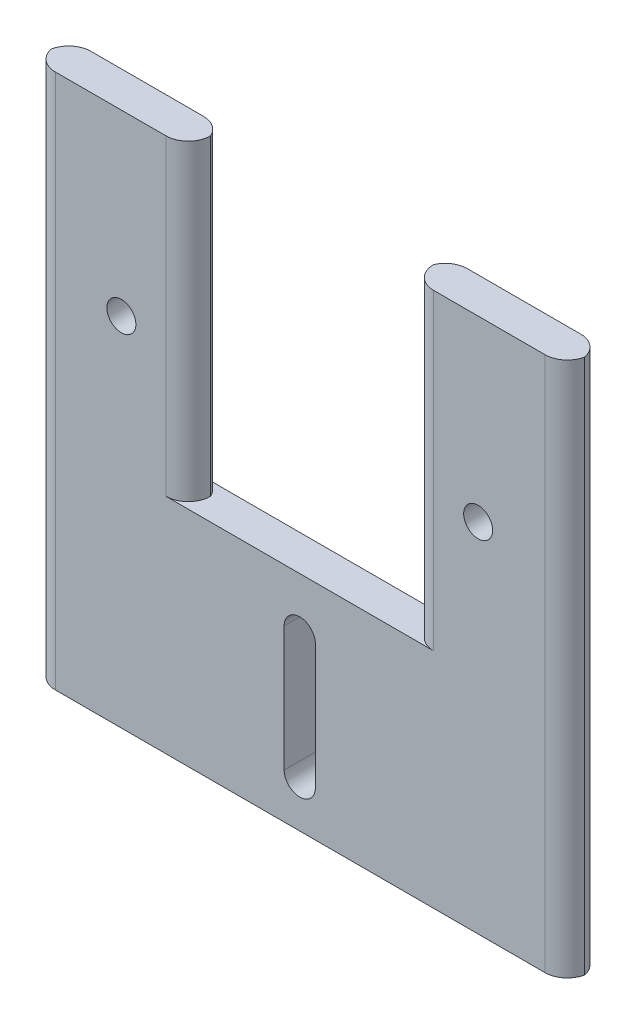
ISO-10303-21;
HEADER;
FILE_DESCRIPTION(('STEP AP214'),'2;1');
FILE_NAME('part.step','',(''),(''),'','','');
FILE_SCHEMA(('AUTOMOTIVE_DESIGN { 1 0 10303 214 1 1 1 1 }'));
ENDSEC;
DATA;
#1=APPLICATION_CONTEXT('core data for automotive mechanical design processes');
#2=APPLICATION_PROTOCOL_DEFINITION('international standard','automotive_design',2000,#1);
#3=PRODUCT_CONTEXT('',#1,'mechanical');
#4=PRODUCT('Part','Part','',(#3));
#5=PRODUCT_RELATED_PRODUCT_CATEGORY('part','',(#4));
#6=PRODUCT_DEFINITION_FORMATION('','',#4);
#7=PRODUCT_DEFINITION_CONTEXT('part definition',#1,'design');
#8=PRODUCT_DEFINITION('design','',#6,#7);
#9=PRODUCT_DEFINITION_SHAPE('','',#8);
#10=(LENGTH_UNIT() NAMED_UNIT(*) SI_UNIT(.MILLI.,.METRE.));
#11=(NAMED_UNIT(*) PLANE_ANGLE_UNIT() SI_UNIT($,.RADIAN.));
#12=(NAMED_UNIT(*) SI_UNIT($,.STERADIAN.) SOLID_ANGLE_UNIT());
#13=UNCERTAINTY_MEASURE_WITH_UNIT(LENGTH_MEASURE(1.E-05),#10,'distance_accuracy_value','');
#14=(GEOMETRIC_REPRESENTATION_CONTEXT(3) GLOBAL_UNCERTAINTY_ASSIGNED_CONTEXT((#13)) GLOBAL_UNIT_ASSIGNED_CONTEXT((#10,
#11,#12)) REPRESENTATION_CONTEXT('',''));
#15=CARTESIAN_POINT('',(0.,0.,0.));
#16=DIRECTION('',(0.,0.,1.));
#17=DIRECTION('',(1.,0.,0.));
#18=AXIS2_PLACEMENT_3D('',#15,#16,#17);
#19=CARTESIAN_POINT('',(70.,60.,8.));
#20=DIRECTION('',(0.,-1.,0.));
#21=DIRECTION('',(1.,0.,0.));
#22=AXIS2_PLACEMENT_3D('',#19,#20,#21);
#23=PLANE('',#22);
#24=CARTESIAN_POINT('',(55.,60.,3.));
#25=DIRECTION('',(0.,-1.,0.));
#26=DIRECTION('',(1.,0.,0.));
#27=AXIS2_PLACEMENT_3D('',#24,#25,#26);
#28=CIRCLE('',#27,5.);
#29=CARTESIAN_POINT('',(55.,60.,8.));
#30=VERTEX_POINT('',#29);
#31=CARTESIAN_POINT('',(59.8989794855663,60.,4.));
#32=VERTEX_POINT('',#31);
#33=EDGE_CURVE('E319',#30,#32,#28,.F.);
#34=ORIENTED_EDGE('',*,*,#33,.T.);
#35=CARTESIAN_POINT('',(55.,60.,5.));
#36=DIRECTION('',(0.,-1.,0.));
#37=DIRECTION('',(1.,0.,0.));
#38=AXIS2_PLACEMENT_3D('',#35,#36,#37);
#39=CIRCLE('',#38,5.);
#40=CARTESIAN_POINT('',(55.,60.,0.));
#41=VERTEX_POINT('',#40);
#42=EDGE_CURVE('E323',#32,#41,#39,.F.);
#43=ORIENTED_EDGE('',*,*,#42,.T.);
#44=DIRECTION('',(-1.,0.,0.));
#45=VECTOR('',#44,1.);
#46=CARTESIAN_POINT('',(70.,60.,0.));
#47=LINE('',#46,#45);
#48=CARTESIAN_POINT('',(29.5825756949558,60.,0.));
#49=VERTEX_POINT('',#48);
#50=EDGE_CURVE('E237',#41,#49,#47,.T.);
#51=ORIENTED_EDGE('',*,*,#50,.T.);
#52=CARTESIAN_POINT('',(29.5825756949558,60.,5.));
#53=DIRECTION('',(0.,-1.,0.));
#54=DIRECTION('',(1.,0.,0.));
#55=AXIS2_PLACEMENT_3D('',#52,#53,#54);
#56=CIRCLE('',#55,5.);
#57=CARTESIAN_POINT('',(25.,60.,3.));
#58=VERTEX_POINT('',#57);
#59=EDGE_CURVE('E277',#49,#58,#56,.F.);
#60=ORIENTED_EDGE('',*,*,#59,.T.);
#61=CARTESIAN_POINT('',(30.,60.,3.));
#62=DIRECTION('',(0.,-1.,0.));
#63=DIRECTION('',(1.,0.,0.));
#64=AXIS2_PLACEMENT_3D('',#61,#62,#63);
#65=CIRCLE('',#64,5.);
#66=CARTESIAN_POINT('',(30.,60.,8.));
#67=VERTEX_POINT('',#66);
#68=EDGE_CURVE('E249',#58,#67,#65,.F.);
#69=ORIENTED_EDGE('',*,*,#68,.T.);
#70=DIRECTION('',(-1.,0.,0.));
#71=VECTOR('',#70,1.);
#72=CARTESIAN_POINT('',(70.,60.,8.));
#73=LINE('',#72,#71);
#74=EDGE_CURVE('E240',#30,#67,#73,.T.);
#75=ORIENTED_EDGE('',*,*,#74,.F.);
#76=EDGE_LOOP('',(#34,#43,#51,#60,#69,#75));
#77=FACE_BOUND('',#76,.T.);
#78=ADVANCED_FACE('F42',(#77),#23,.F.);
#79=CARTESIAN_POINT('',(70.,-60.,8.));
#80=DIRECTION('',(0.,1.,0.));
#81=DIRECTION('',(-1.,0.,0.));
#82=AXIS2_PLACEMENT_3D('',#79,#80,#81);
#83=PLANE('',#82);
#84=DIRECTION('',(1.,0.,0.));
#85=VECTOR('',#84,1.);
#86=CARTESIAN_POINT('',(70.,-60.,0.));
#87=LINE('',#86,#85);
#88=CARTESIAN_POINT('',(-54.8206924068234,-60.,0.));
#89=VERTEX_POINT('',#88);
#90=CARTESIAN_POINT('',(55.,-60.,0.));
#91=VERTEX_POINT('',#90);
#92=EDGE_CURVE('E218',#89,#91,#87,.T.);
#93=ORIENTED_EDGE('',*,*,#92,.T.);
#94=CARTESIAN_POINT('',(55.,-60.,5.));
#95=DIRECTION('',(0.,1.,0.));
#96=DIRECTION('',(-1.,0.,0.));
#97=AXIS2_PLACEMENT_3D('',#94,#95,#96);
#98=CIRCLE('',#97,5.);
#99=CARTESIAN_POINT('',(59.8989794855664,-60.,4.));
#100=VERTEX_POINT('',#99);
#101=EDGE_CURVE('E320',#91,#100,#98,.F.);
#102=ORIENTED_EDGE('',*,*,#101,.T.);
#103=CARTESIAN_POINT('',(55.,-60.,3.));
#104=DIRECTION('',(0.,1.,0.));
#105=DIRECTION('',(-1.,0.,0.));
#106=AXIS2_PLACEMENT_3D('',#103,#104,#105);
#107=CIRCLE('',#106,5.);
#108=CARTESIAN_POINT('',(55.,-60.,8.));
#109=VERTEX_POINT('',#108);
#110=EDGE_CURVE('E314',#100,#109,#107,.F.);
#111=ORIENTED_EDGE('',*,*,#110,.T.);
#112=DIRECTION('',(1.,0.,0.));
#113=VECTOR('',#112,1.);
#114=CARTESIAN_POINT('',(70.,-60.,8.));
#115=LINE('',#114,#113);
#116=CARTESIAN_POINT('',(-54.8206924068234,-60.,8.));
#117=VERTEX_POINT('',#116);
#118=EDGE_CURVE('E233',#117,#109,#115,.T.);
#119=ORIENTED_EDGE('',*,*,#118,.F.);
#120=CARTESIAN_POINT('',(-54.8206924068234,-60.,3.));
#121=DIRECTION('',(0.,1.,0.));
#122=DIRECTION('',(-1.,0.,0.));
#123=AXIS2_PLACEMENT_3D('',#120,#121,#122);
#124=CIRCLE('',#123,5.);
#125=CARTESIAN_POINT('',(-59.7196718923897,-60.,4.));
#126=VERTEX_POINT('',#125);
#127=EDGE_CURVE('E306',#117,#126,#124,.F.);
#128=ORIENTED_EDGE('',*,*,#127,.T.);
#129=CARTESIAN_POINT('',(-54.8206924068234,-60.,5.));
#130=DIRECTION('',(0.,1.,0.));
#131=DIRECTION('',(-1.,0.,0.));
#132=AXIS2_PLACEMENT_3D('',#129,#130,#131);
#133=CIRCLE('',#132,5.);
#134=EDGE_CURVE('E313',#126,#89,#133,.F.);
#135=ORIENTED_EDGE('',*,*,#134,.T.);
#136=EDGE_LOOP('',(#93,#102,#111,#119,#128,#135));
#137=FACE_BOUND('',#136,.T.);
#138=ADVANCED_FACE('F358',(#137),#83,.F.);
#139=DIRECTION('',(1.,0.,0.));
#140=VECTOR('',#139,1.);
#141=CARTESIAN_POINT('',(70.,60.,0.));
#142=LINE('',#141,#140);
#143=CARTESIAN_POINT('',(-29.5825756949559,60.,0.));
#144=VERTEX_POINT('',#143);
#145=CARTESIAN_POINT('',(-54.8206924068234,60.,0.));
#146=VERTEX_POINT('',#145);
#147=EDGE_CURVE('E245',#144,#146,#142,.F.);
#148=ORIENTED_EDGE('',*,*,#147,.T.);
#149=CARTESIAN_POINT('',(-54.8206924068234,60.,5.));
#150=DIRECTION('',(0.,-1.,0.));
#151=DIRECTION('',(1.,0.,0.));
#152=AXIS2_PLACEMENT_3D('',#149,#150,#151);
#153=CIRCLE('',#152,5.);
#154=CARTESIAN_POINT('',(-59.7196718923897,60.,4.));
#155=VERTEX_POINT('',#154);
#156=EDGE_CURVE('E11',#146,#155,#153,.F.);
#157=ORIENTED_EDGE('',*,*,#156,.T.);
#158=CARTESIAN_POINT('',(-54.8206924068234,60.,3.));
#159=DIRECTION('',(0.,-1.,0.));
#160=DIRECTION('',(1.,0.,0.));
#161=AXIS2_PLACEMENT_3D('',#158,#159,#160);
#162=CIRCLE('',#161,5.);
#163=CARTESIAN_POINT('',(-54.8206924068234,60.,8.));
#164=VERTEX_POINT('',#163);
#165=EDGE_CURVE('E53',#155,#164,#162,.F.);
#166=ORIENTED_EDGE('',*,*,#165,.T.);
#167=DIRECTION('',(1.,0.,0.));
#168=VECTOR('',#167,1.);
#169=CARTESIAN_POINT('',(0.,60.,8.));
#170=LINE('',#169,#168);
#171=CARTESIAN_POINT('',(-30.,60.,8.));
#172=VERTEX_POINT('',#171);
#173=EDGE_CURVE('E234',#172,#164,#170,.F.);
#174=ORIENTED_EDGE('',*,*,#173,.F.);
#175=CARTESIAN_POINT('',(-30.,60.,3.));
#176=DIRECTION('',(0.,-1.,0.));
#177=DIRECTION('',(1.,0.,0.));
#178=AXIS2_PLACEMENT_3D('',#175,#176,#177);
#179=CIRCLE('',#178,5.);
#180=CARTESIAN_POINT('',(-25.,60.,3.));
#181=VERTEX_POINT('',#180);
#182=EDGE_CURVE('E263',#172,#181,#179,.F.);
#183=ORIENTED_EDGE('',*,*,#182,.T.);
#184=CARTESIAN_POINT('',(-29.5825756949559,60.,5.));
#185=DIRECTION('',(0.,-1.,0.));
#186=DIRECTION('',(1.,0.,0.));
#187=AXIS2_PLACEMENT_3D('',#184,#185,#186);
#188=CIRCLE('',#187,5.);
#189=EDGE_CURVE('E276',#181,#144,#188,.F.);
#190=ORIENTED_EDGE('',*,*,#189,.T.);
#191=EDGE_LOOP('',(#148,#157,#166,#174,#183,#190));
#192=FACE_BOUND('',#191,.T.);
#193=ADVANCED_FACE('F379',(#192),#23,.F.);
#194=CARTESIAN_POINT('',(0.,0.,8.));
#195=DIRECTION('',(0.,0.,1.));
#196=DIRECTION('',(1.,0.,0.));
#197=AXIS2_PLACEMENT_3D('',#194,#195,#196);
#198=PLANE('',#197);
#199=ORIENTED_EDGE('',*,*,#118,.T.);
#200=DIRECTION('',(0.,-1.,0.));
#201=VECTOR('',#200,1.);
#202=CARTESIAN_POINT('',(55.,60.,8.));
#203=LINE('',#202,#201);
#204=EDGE_CURVE('E328',#109,#30,#203,.F.);
#205=ORIENTED_EDGE('',*,*,#204,.T.);
#206=ORIENTED_EDGE('',*,*,#74,.T.);
#207=DIRECTION('',(0.,1.,0.));
#208=VECTOR('',#207,1.);
#209=CARTESIAN_POINT('',(30.,-10.,8.));
#210=LINE('',#209,#208);
#211=CARTESIAN_POINT('',(30.,-10.,8.));
#212=VERTEX_POINT('',#211);
#213=EDGE_CURVE('E254',#67,#212,#210,.F.);
#214=ORIENTED_EDGE('',*,*,#213,.T.);
#215=DIRECTION('',(1.,0.,0.));
#216=VECTOR('',#215,1.);
#217=CARTESIAN_POINT('',(25.,-10.,8.));
#218=LINE('',#217,#216);
#219=CARTESIAN_POINT('',(-30.,-10.,8.));
#220=VERTEX_POINT('',#219);
#221=EDGE_CURVE('E186',#220,#212,#218,.T.);
#222=ORIENTED_EDGE('',*,*,#221,.F.);
#223=DIRECTION('',(0.,-1.,0.));
#224=VECTOR('',#223,1.);
#225=CARTESIAN_POINT('',(-30.,60.,8.));
#226=LINE('',#225,#224);
#227=EDGE_CURVE('E255',#220,#172,#226,.F.);
#228=ORIENTED_EDGE('',*,*,#227,.T.);
#229=ORIENTED_EDGE('',*,*,#173,.T.);
#230=DIRECTION('',(0.,1.,0.));
#231=VECTOR('',#230,1.);
#232=CARTESIAN_POINT('',(-54.8206924068234,-60.,8.));
#233=LINE('',#232,#231);
#234=EDGE_CURVE('E326',#164,#117,#233,.F.);
#235=ORIENTED_EDGE('',*,*,#234,.T.);
#236=EDGE_LOOP('',(#199,#205,#206,#214,#222,#228,#229,#235));
#237=FACE_BOUND('',#236,.T.);
#238=CARTESIAN_POINT('',(0.,-49.9,8.));
#239=DIRECTION('',(0.,0.,1.));
#240=DIRECTION('',(1.,0.,0.));
#241=AXIS2_PLACEMENT_3D('',#238,#239,#240);
#242=CIRCLE('',#241,3.5);
#243=CARTESIAN_POINT('',(-3.5,-49.9,8.));
#244=VERTEX_POINT('',#243);
#245=CARTESIAN_POINT('',(3.5,-49.9,8.));
#246=VERTEX_POINT('',#245);
#247=EDGE_CURVE('E162',#244,#246,#242,.T.);
#248=ORIENTED_EDGE('',*,*,#247,.F.);
#249=DIRECTION('',(0.,1.,0.));
#250=VECTOR('',#249,1.);
#251=CARTESIAN_POINT('',(-3.5,-49.9,8.));
#252=LINE('',#251,#250);
#253=CARTESIAN_POINT('',(-3.5,-21.9,8.));
#254=VERTEX_POINT('',#253);
#255=EDGE_CURVE('E181',#244,#254,#252,.T.);
#256=ORIENTED_EDGE('',*,*,#255,.T.);
#257=CARTESIAN_POINT('',(0.,-21.9,8.));
#258=DIRECTION('',(0.,0.,1.));
#259=DIRECTION('',(1.,0.,0.));
#260=AXIS2_PLACEMENT_3D('',#257,#258,#259);
#261=CIRCLE('',#260,3.5);
#262=CARTESIAN_POINT('',(3.5,-21.9,8.));
#263=VERTEX_POINT('',#262);
#264=EDGE_CURVE('E189',#263,#254,#261,.T.);
#265=ORIENTED_EDGE('',*,*,#264,.F.);
#266=DIRECTION('',(0.,1.,0.));
#267=VECTOR('',#266,1.);
#268=CARTESIAN_POINT('',(3.5,-49.9,8.));
#269=LINE('',#268,#267);
#270=EDGE_CURVE('E200',#246,#263,#269,.T.);
#271=ORIENTED_EDGE('',*,*,#270,.F.);
#272=EDGE_LOOP('',(#248,#256,#265,#271));
#273=FACE_BOUND('',#272,.T.);
#274=CARTESIAN_POINT('',(-40.,20.,8.));
#275=DIRECTION('',(0.,0.,1.));
#276=DIRECTION('',(1.,0.,0.));
#277=AXIS2_PLACEMENT_3D('',#274,#275,#276);
#278=CIRCLE('',#277,3.25);
#279=CARTESIAN_POINT('',(-36.75,20.,8.));
#280=VERTEX_POINT('',#279);
#281=EDGE_CURVE('E219',#280,#280,#278,.T.);
#282=ORIENTED_EDGE('',*,*,#281,.F.);
#283=EDGE_LOOP('',(#282));
#284=FACE_BOUND('',#283,.T.);
#285=CARTESIAN_POINT('',(40.,20.,8.));
#286=DIRECTION('',(0.,0.,1.));
#287=DIRECTION('',(1.,0.,0.));
#288=AXIS2_PLACEMENT_3D('',#285,#286,#287);
#289=CIRCLE('',#288,3.25);
#290=CARTESIAN_POINT('',(43.25,20.,8.));
#291=VERTEX_POINT('',#290);
#292=EDGE_CURVE('E221',#291,#291,#289,.T.);
#293=ORIENTED_EDGE('',*,*,#292,.F.);
#294=EDGE_LOOP('',(#293));
#295=FACE_BOUND('',#294,.T.);
#296=ADVANCED_FACE('F354',(#237,#273,#284,#295),#198,.T.);
#297=CARTESIAN_POINT('',(0.,0.,0.));
#298=DIRECTION('',(0.,0.,1.));
#299=DIRECTION('',(1.,0.,0.));
#300=AXIS2_PLACEMENT_3D('',#297,#298,#299);
#301=PLANE('',#300);
#302=ORIENTED_EDGE('',*,*,#50,.F.);
#303=DIRECTION('',(0.,-1.,0.));
#304=VECTOR('',#303,1.);
#305=CARTESIAN_POINT('',(55.,0.,0.));
#306=LINE('',#305,#304);
#307=EDGE_CURVE('E302',#41,#91,#306,.T.);
#308=ORIENTED_EDGE('',*,*,#307,.T.);
#309=ORIENTED_EDGE('',*,*,#92,.F.);
#310=DIRECTION('',(0.,1.,0.));
#311=VECTOR('',#310,1.);
#312=CARTESIAN_POINT('',(-54.8206924068234,0.,0.));
#313=LINE('',#312,#311);
#314=EDGE_CURVE('E290',#89,#146,#313,.T.);
#315=ORIENTED_EDGE('',*,*,#314,.T.);
#316=ORIENTED_EDGE('',*,*,#147,.F.);
#317=DIRECTION('',(0.,-1.,0.));
#318=VECTOR('',#317,1.);
#319=CARTESIAN_POINT('',(-29.5825756949559,0.,0.));
#320=LINE('',#319,#318);
#321=CARTESIAN_POINT('',(-29.5825756949558,-10.,0.));
#322=VERTEX_POINT('',#321);
#323=EDGE_CURVE('E271',#144,#322,#320,.T.);
#324=ORIENTED_EDGE('',*,*,#323,.T.);
#325=DIRECTION('',(1.,0.,0.));
#326=VECTOR('',#325,1.);
#327=CARTESIAN_POINT('',(25.,-10.,0.));
#328=LINE('',#327,#326);
#329=CARTESIAN_POINT('',(29.5825756949558,-10.,0.));
#330=VERTEX_POINT('',#329);
#331=EDGE_CURVE('E199',#322,#330,#328,.T.);
#332=ORIENTED_EDGE('',*,*,#331,.T.);
#333=DIRECTION('',(0.,1.,0.));
#334=VECTOR('',#333,1.);
#335=CARTESIAN_POINT('',(29.5825756949558,0.,0.));
#336=LINE('',#335,#334);
#337=EDGE_CURVE('E275',#330,#49,#336,.T.);
#338=ORIENTED_EDGE('',*,*,#337,.T.);
#339=EDGE_LOOP('',(#302,#308,#309,#315,#316,#324,#332,#338));
#340=FACE_BOUND('',#339,.T.);
#341=DIRECTION('',(0.,1.,0.));
#342=VECTOR('',#341,1.);
#343=CARTESIAN_POINT('',(-3.5,-49.9,0.));
#344=LINE('',#343,#342);
#345=CARTESIAN_POINT('',(-3.5,-49.9,0.));
#346=VERTEX_POINT('',#345);
#347=CARTESIAN_POINT('',(-3.5,-21.9,0.));
#348=VERTEX_POINT('',#347);
#349=EDGE_CURVE('E166',#346,#348,#344,.T.);
#350=ORIENTED_EDGE('',*,*,#349,.F.);
#351=CARTESIAN_POINT('',(0.,-49.9,0.));
#352=DIRECTION('',(0.,0.,1.));
#353=DIRECTION('',(1.,0.,0.));
#354=AXIS2_PLACEMENT_3D('',#351,#352,#353);
#355=CIRCLE('',#354,3.5);
#356=CARTESIAN_POINT('',(3.5,-49.9,0.));
#357=VERTEX_POINT('',#356);
#358=EDGE_CURVE('E159',#346,#357,#355,.T.);
#359=ORIENTED_EDGE('',*,*,#358,.T.);
#360=DIRECTION('',(0.,1.,0.));
#361=VECTOR('',#360,1.);
#362=CARTESIAN_POINT('',(3.5,-49.9,0.));
#363=LINE('',#362,#361);
#364=CARTESIAN_POINT('',(3.5,-21.9,0.));
#365=VERTEX_POINT('',#364);
#366=EDGE_CURVE('E172',#357,#365,#363,.T.);
#367=ORIENTED_EDGE('',*,*,#366,.T.);
#368=CARTESIAN_POINT('',(0.,-21.9,0.));
#369=DIRECTION('',(0.,0.,1.));
#370=DIRECTION('',(1.,0.,0.));
#371=AXIS2_PLACEMENT_3D('',#368,#369,#370);
#372=CIRCLE('',#371,3.5);
#373=EDGE_CURVE('E176',#365,#348,#372,.T.);
#374=ORIENTED_EDGE('',*,*,#373,.T.);
#375=EDGE_LOOP('',(#350,#359,#367,#374));
#376=FACE_BOUND('',#375,.T.);
#377=CARTESIAN_POINT('',(-40.,20.,0.));
#378=DIRECTION('',(0.,0.,1.));
#379=DIRECTION('',(1.,0.,0.));
#380=AXIS2_PLACEMENT_3D('',#377,#378,#379);
#381=CIRCLE('',#380,3.25);
#382=CARTESIAN_POINT('',(-36.75,20.,0.));
#383=VERTEX_POINT('',#382);
#384=EDGE_CURVE('E214',#383,#383,#381,.T.);
#385=ORIENTED_EDGE('',*,*,#384,.T.);
#386=EDGE_LOOP('',(#385));
#387=FACE_BOUND('',#386,.T.);
#388=CARTESIAN_POINT('',(40.,20.,0.));
#389=DIRECTION('',(0.,0.,1.));
#390=DIRECTION('',(1.,0.,0.));
#391=AXIS2_PLACEMENT_3D('',#388,#389,#390);
#392=CIRCLE('',#391,3.25);
#393=CARTESIAN_POINT('',(43.25,20.,0.));
#394=VERTEX_POINT('',#393);
#395=EDGE_CURVE('E207',#394,#394,#392,.T.);
#396=ORIENTED_EDGE('',*,*,#395,.T.);
#397=EDGE_LOOP('',(#396));
#398=FACE_BOUND('',#397,.T.);
#399=ADVANCED_FACE('F179',(#340,#376,#387,#398),#301,.F.);
#400=CARTESIAN_POINT('',(40.,20.,0.));
#401=DIRECTION('',(0.,0.,1.));
#402=DIRECTION('',(1.,0.,0.));
#403=AXIS2_PLACEMENT_3D('',#400,#401,#402);
#404=CYLINDRICAL_SURFACE('',#403,3.25);
#405=ORIENTED_EDGE('',*,*,#395,.F.);
#406=EDGE_LOOP('',(#405));
#407=FACE_BOUND('',#406,.T.);
#408=ORIENTED_EDGE('',*,*,#292,.T.);
#409=EDGE_LOOP('',(#408));
#410=FACE_BOUND('',#409,.T.);
#411=ADVANCED_FACE('F418',(#407,#410),#404,.F.);
#412=CARTESIAN_POINT('',(-40.,20.,0.));
#413=DIRECTION('',(0.,0.,1.));
#414=DIRECTION('',(1.,0.,0.));
#415=AXIS2_PLACEMENT_3D('',#412,#413,#414);
#416=CYLINDRICAL_SURFACE('',#415,3.25);
#417=ORIENTED_EDGE('',*,*,#384,.F.);
#418=EDGE_LOOP('',(#417));
#419=FACE_BOUND('',#418,.T.);
#420=ORIENTED_EDGE('',*,*,#281,.T.);
#421=EDGE_LOOP('',(#420));
#422=FACE_BOUND('',#421,.T.);
#423=ADVANCED_FACE('F419',(#419,#422),#416,.F.);
#424=CARTESIAN_POINT('',(0.,-49.9,0.));
#425=DIRECTION('',(0.,0.,1.));
#426=DIRECTION('',(1.,0.,0.));
#427=AXIS2_PLACEMENT_3D('',#424,#425,#426);
#428=CYLINDRICAL_SURFACE('',#427,3.5);
#429=ORIENTED_EDGE('',*,*,#247,.T.);
#430=DIRECTION('',(0.,0.,1.));
#431=VECTOR('',#430,1.);
#432=CARTESIAN_POINT('',(3.5,-49.9,0.));
#433=LINE('',#432,#431);
#434=EDGE_CURVE('E156',#357,#246,#433,.T.);
#435=ORIENTED_EDGE('',*,*,#434,.F.);
#436=ORIENTED_EDGE('',*,*,#358,.F.);
#437=DIRECTION('',(0.,0.,1.));
#438=VECTOR('',#437,1.);
#439=CARTESIAN_POINT('',(-3.5,-49.9,0.));
#440=LINE('',#439,#438);
#441=EDGE_CURVE('E206',#346,#244,#440,.T.);
#442=ORIENTED_EDGE('',*,*,#441,.T.);
#443=EDGE_LOOP('',(#429,#435,#436,#442));
#444=FACE_BOUND('',#443,.T.);
#445=ADVANCED_FACE('F158',(#444),#428,.F.);
#446=CARTESIAN_POINT('',(-3.5,-49.9,0.));
#447=DIRECTION('',(1.,0.,0.));
#448=DIRECTION('',(0.,0.,-1.));
#449=AXIS2_PLACEMENT_3D('',#446,#447,#448);
#450=PLANE('',#449);
#451=ORIENTED_EDGE('',*,*,#255,.F.);
#452=ORIENTED_EDGE('',*,*,#441,.F.);
#453=ORIENTED_EDGE('',*,*,#349,.T.);
#454=DIRECTION('',(0.,0.,1.));
#455=VECTOR('',#454,1.);
#456=CARTESIAN_POINT('',(-3.5,-21.9,0.));
#457=LINE('',#456,#455);
#458=EDGE_CURVE('E209',#348,#254,#457,.T.);
#459=ORIENTED_EDGE('',*,*,#458,.T.);
#460=EDGE_LOOP('',(#451,#452,#453,#459));
#461=FACE_BOUND('',#460,.T.);
#462=ADVANCED_FACE('F430',(#461),#450,.T.);
#463=CARTESIAN_POINT('',(0.,-21.9,0.));
#464=DIRECTION('',(0.,0.,1.));
#465=DIRECTION('',(1.,0.,0.));
#466=AXIS2_PLACEMENT_3D('',#463,#464,#465);
#467=CYLINDRICAL_SURFACE('',#466,3.5);
#468=ORIENTED_EDGE('',*,*,#264,.T.);
#469=ORIENTED_EDGE('',*,*,#458,.F.);
#470=ORIENTED_EDGE('',*,*,#373,.F.);
#471=DIRECTION('',(0.,0.,1.));
#472=VECTOR('',#471,1.);
#473=CARTESIAN_POINT('',(3.5,-21.9,0.));
#474=LINE('',#473,#472);
#475=EDGE_CURVE('E169',#365,#263,#474,.T.);
#476=ORIENTED_EDGE('',*,*,#475,.T.);
#477=EDGE_LOOP('',(#468,#469,#470,#476));
#478=FACE_BOUND('',#477,.T.);
#479=ADVANCED_FACE('F429',(#478),#467,.F.);
#480=CARTESIAN_POINT('',(3.5,-49.9,0.));
#481=DIRECTION('',(1.,0.,0.));
#482=DIRECTION('',(0.,0.,-1.));
#483=AXIS2_PLACEMENT_3D('',#480,#481,#482);
#484=PLANE('',#483);
#485=ORIENTED_EDGE('',*,*,#270,.T.);
#486=ORIENTED_EDGE('',*,*,#475,.F.);
#487=ORIENTED_EDGE('',*,*,#366,.F.);
#488=ORIENTED_EDGE('',*,*,#434,.T.);
#489=EDGE_LOOP('',(#485,#486,#487,#488));
#490=FACE_BOUND('',#489,.T.);
#491=ADVANCED_FACE('F175',(#490),#484,.F.);
#492=CARTESIAN_POINT('',(25.,-10.,0.));
#493=DIRECTION('',(0.,-1.,0.));
#494=DIRECTION('',(1.,0.,0.));
#495=AXIS2_PLACEMENT_3D('',#492,#493,#494);
#496=PLANE('',#495);
#497=ORIENTED_EDGE('',*,*,#221,.T.);
#498=CARTESIAN_POINT('',(30.,-10.,3.));
#499=DIRECTION('',(0.,-1.,0.));
#500=DIRECTION('',(1.,0.,0.));
#501=AXIS2_PLACEMENT_3D('',#498,#499,#500);
#502=CIRCLE('',#501,5.);
#503=CARTESIAN_POINT('',(25.,-10.,3.));
#504=VERTEX_POINT('',#503);
#505=EDGE_CURVE('E262',#212,#504,#502,.T.);
#506=ORIENTED_EDGE('',*,*,#505,.T.);
#507=CARTESIAN_POINT('',(29.5825756949558,-10.,5.));
#508=DIRECTION('',(0.,-1.,0.));
#509=DIRECTION('',(1.,0.,0.));
#510=AXIS2_PLACEMENT_3D('',#507,#508,#509);
#511=CIRCLE('',#510,5.);
#512=EDGE_CURVE('E278',#504,#330,#511,.T.);
#513=ORIENTED_EDGE('',*,*,#512,.T.);
#514=ORIENTED_EDGE('',*,*,#331,.F.);
#515=CARTESIAN_POINT('',(-29.5825756949559,-10.,5.));
#516=DIRECTION('',(0.,-1.,0.));
#517=DIRECTION('',(1.,0.,0.));
#518=AXIS2_PLACEMENT_3D('',#515,#516,#517);
#519=CIRCLE('',#518,5.);
#520=CARTESIAN_POINT('',(-25.,-10.,3.));
#521=VERTEX_POINT('',#520);
#522=EDGE_CURVE('E285',#322,#521,#519,.T.);
#523=ORIENTED_EDGE('',*,*,#522,.T.);
#524=CARTESIAN_POINT('',(-30.,-10.,3.));
#525=DIRECTION('',(0.,-1.,0.));
#526=DIRECTION('',(1.,0.,0.));
#527=AXIS2_PLACEMENT_3D('',#524,#525,#526);
#528=CIRCLE('',#527,5.);
#529=EDGE_CURVE('E270',#521,#220,#528,.T.);
#530=ORIENTED_EDGE('',*,*,#529,.T.);
#531=EDGE_LOOP('',(#497,#506,#513,#514,#523,#530));
#532=FACE_BOUND('',#531,.T.);
#533=ADVANCED_FACE('F373',(#532),#496,.F.);
#534=CARTESIAN_POINT('',(30.,-10.,3.));
#535=DIRECTION('',(0.,-1.,0.));
#536=DIRECTION('',(1.,0.,0.));
#537=AXIS2_PLACEMENT_3D('',#534,#535,#536);
#538=CYLINDRICAL_SURFACE('',#537,5.);
#539=ORIENTED_EDGE('',*,*,#505,.F.);
#540=ORIENTED_EDGE('',*,*,#213,.F.);
#541=ORIENTED_EDGE('',*,*,#68,.F.);
#542=DIRECTION('',(0.,1.,0.));
#543=VECTOR('',#542,1.);
#544=CARTESIAN_POINT('',(25.,60.,3.));
#545=LINE('',#544,#543);
#546=EDGE_CURVE('E238',#504,#58,#545,.T.);
#547=ORIENTED_EDGE('',*,*,#546,.F.);
#548=EDGE_LOOP('',(#539,#540,#541,#547));
#549=FACE_BOUND('',#548,.T.);
#550=ADVANCED_FACE('F369',(#549),#538,.T.);
#551=CARTESIAN_POINT('',(-30.,-10.,3.));
#552=DIRECTION('',(0.,1.,0.));
#553=DIRECTION('',(0.,0.,1.));
#554=AXIS2_PLACEMENT_3D('',#551,#552,#553);
#555=CYLINDRICAL_SURFACE('',#554,5.);
#556=ORIENTED_EDGE('',*,*,#182,.F.);
#557=ORIENTED_EDGE('',*,*,#227,.F.);
#558=ORIENTED_EDGE('',*,*,#529,.F.);
#559=DIRECTION('',(0.,-1.,0.));
#560=VECTOR('',#559,1.);
#561=CARTESIAN_POINT('',(-25.,-10.,3.));
#562=LINE('',#561,#560);
#563=EDGE_CURVE('E259',#181,#521,#562,.T.);
#564=ORIENTED_EDGE('',*,*,#563,.F.);
#565=EDGE_LOOP('',(#556,#557,#558,#564));
#566=FACE_BOUND('',#565,.T.);
#567=ADVANCED_FACE('F378',(#566),#555,.T.);
#568=CARTESIAN_POINT('',(29.5825756949558,-10.,5.));
#569=DIRECTION('',(0.,1.,0.));
#570=DIRECTION('',(-1.,0.,0.));
#571=AXIS2_PLACEMENT_3D('',#568,#569,#570);
#572=CYLINDRICAL_SURFACE('',#571,5.);
#573=ORIENTED_EDGE('',*,*,#512,.F.);
#574=ORIENTED_EDGE('',*,*,#546,.T.);
#575=ORIENTED_EDGE('',*,*,#59,.F.);
#576=ORIENTED_EDGE('',*,*,#337,.F.);
#577=EDGE_LOOP('',(#573,#574,#575,#576));
#578=FACE_BOUND('',#577,.T.);
#579=ADVANCED_FACE('F386',(#578),#572,.T.);
#580=CARTESIAN_POINT('',(-29.5825756949559,-10.,5.));
#581=DIRECTION('',(0.,-1.,0.));
#582=DIRECTION('',(0.,0.,-1.));
#583=AXIS2_PLACEMENT_3D('',#580,#581,#582);
#584=CYLINDRICAL_SURFACE('',#583,5.);
#585=ORIENTED_EDGE('',*,*,#189,.F.);
#586=ORIENTED_EDGE('',*,*,#563,.T.);
#587=ORIENTED_EDGE('',*,*,#522,.F.);
#588=ORIENTED_EDGE('',*,*,#323,.F.);
#589=EDGE_LOOP('',(#585,#586,#587,#588));
#590=FACE_BOUND('',#589,.T.);
#591=ADVANCED_FACE('F390',(#590),#584,.T.);
#592=CARTESIAN_POINT('',(55.,-60.,3.));
#593=DIRECTION('',(0.,1.,0.));
#594=DIRECTION('',(-1.,0.,0.));
#595=AXIS2_PLACEMENT_3D('',#592,#593,#594);
#596=CYLINDRICAL_SURFACE('',#595,5.);
#597=DIRECTION('',(0.,1.,0.));
#598=VECTOR('',#597,1.);
#599=CARTESIAN_POINT('',(59.8989794855663,0.,4.));
#600=LINE('',#599,#598);
#601=EDGE_CURVE('E334',#32,#100,#600,.F.);
#602=ORIENTED_EDGE('',*,*,#601,.F.);
#603=ORIENTED_EDGE('',*,*,#33,.F.);
#604=ORIENTED_EDGE('',*,*,#204,.F.);
#605=ORIENTED_EDGE('',*,*,#110,.F.);
#606=EDGE_LOOP('',(#602,#603,#604,#605));
#607=FACE_BOUND('',#606,.T.);
#608=ADVANCED_FACE('F357',(#607),#596,.T.);
#609=CARTESIAN_POINT('',(55.,0.,5.));
#610=DIRECTION('',(0.,-1.,0.));
#611=DIRECTION('',(1.,0.,0.));
#612=AXIS2_PLACEMENT_3D('',#609,#610,#611);
#613=CYLINDRICAL_SURFACE('',#612,5.);
#614=ORIENTED_EDGE('',*,*,#42,.F.);
#615=ORIENTED_EDGE('',*,*,#601,.T.);
#616=ORIENTED_EDGE('',*,*,#101,.F.);
#617=ORIENTED_EDGE('',*,*,#307,.F.);
#618=EDGE_LOOP('',(#614,#615,#616,#617));
#619=FACE_BOUND('',#618,.T.);
#620=ADVANCED_FACE('F398',(#619),#613,.T.);
#621=CARTESIAN_POINT('',(-54.8206924068234,-60.,3.));
#622=DIRECTION('',(0.,-1.,0.));
#623=DIRECTION('',(0.,0.,-1.));
#624=AXIS2_PLACEMENT_3D('',#621,#622,#623);
#625=CYLINDRICAL_SURFACE('',#624,5.);
#626=DIRECTION('',(0.,-1.,0.));
#627=VECTOR('',#626,1.);
#628=CARTESIAN_POINT('',(-59.7196718923897,0.,4.));
#629=LINE('',#628,#627);
#630=EDGE_CURVE('E48',#126,#155,#629,.F.);
#631=ORIENTED_EDGE('',*,*,#630,.F.);
#632=ORIENTED_EDGE('',*,*,#127,.F.);
#633=ORIENTED_EDGE('',*,*,#234,.F.);
#634=ORIENTED_EDGE('',*,*,#165,.F.);
#635=EDGE_LOOP('',(#631,#632,#633,#634));
#636=FACE_BOUND('',#635,.T.);
#637=ADVANCED_FACE('F46',(#636),#625,.T.);
#638=CARTESIAN_POINT('',(-54.8206924068234,0.,5.));
#639=DIRECTION('',(0.,1.,0.));
#640=DIRECTION('',(0.,0.,1.));
#641=AXIS2_PLACEMENT_3D('',#638,#639,#640);
#642=CYLINDRICAL_SURFACE('',#641,5.);
#643=ORIENTED_EDGE('',*,*,#134,.F.);
#644=ORIENTED_EDGE('',*,*,#630,.T.);
#645=ORIENTED_EDGE('',*,*,#156,.F.);
#646=ORIENTED_EDGE('',*,*,#314,.F.);
#647=EDGE_LOOP('',(#643,#644,#645,#646));
#648=FACE_BOUND('',#647,.T.);
#649=ADVANCED_FACE('F344',(#648),#642,.T.);
#650=CLOSED_SHELL('',(#78,#138,#193,#296,#399,#411,#423,#445,#462,#479,#491,#533,#550,#567,#579,
#591,#608,#620,#637,#649));
#651=MANIFOLD_SOLID_BREP('B2',#650);
#652=ADVANCED_BREP_SHAPE_REPRESENTATION('',(#18,#651),#14);
#653=SHAPE_DEFINITION_REPRESENTATION(#9,#652);
ENDSEC;
END-ISO-10303-21;
